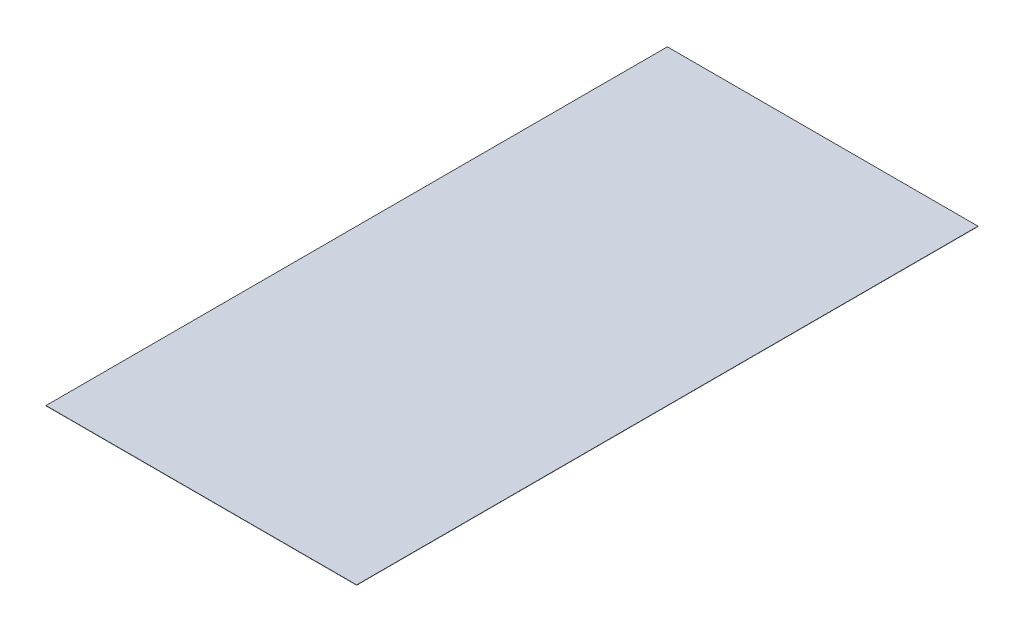
ISO-10303-21;
HEADER;
FILE_DESCRIPTION(('STEP AP214'),'2;1');
FILE_NAME('part.step','',(''),(''),'','','');
FILE_SCHEMA(('AUTOMOTIVE_DESIGN { 1 0 10303 214 1 1 1 1 }'));
ENDSEC;
DATA;
#1=APPLICATION_CONTEXT('core data for automotive mechanical design processes');
#2=APPLICATION_PROTOCOL_DEFINITION('international standard','automotive_design',2000,#1);
#3=PRODUCT_CONTEXT('',#1,'mechanical');
#4=PRODUCT('Part','Part','',(#3));
#5=PRODUCT_RELATED_PRODUCT_CATEGORY('part','',(#4));
#6=PRODUCT_DEFINITION_FORMATION('','',#4);
#7=PRODUCT_DEFINITION_CONTEXT('part definition',#1,'design');
#8=PRODUCT_DEFINITION('design','',#6,#7);
#9=PRODUCT_DEFINITION_SHAPE('','',#8);
#10=(LENGTH_UNIT() NAMED_UNIT(*) SI_UNIT(.MILLI.,.METRE.));
#11=(NAMED_UNIT(*) PLANE_ANGLE_UNIT() SI_UNIT($,.RADIAN.));
#12=(NAMED_UNIT(*) SI_UNIT($,.STERADIAN.) SOLID_ANGLE_UNIT());
#13=UNCERTAINTY_MEASURE_WITH_UNIT(LENGTH_MEASURE(1.E-05),#10,'distance_accuracy_value','');
#14=(GEOMETRIC_REPRESENTATION_CONTEXT(3) GLOBAL_UNCERTAINTY_ASSIGNED_CONTEXT((#13)) GLOBAL_UNIT_ASSIGNED_CONTEXT((#10,
#11,#12)) REPRESENTATION_CONTEXT('',''));
#15=CARTESIAN_POINT('',(0.,0.,0.));
#16=DIRECTION('',(0.,0.,1.));
#17=DIRECTION('',(1.,0.,0.));
#18=AXIS2_PLACEMENT_3D('',#15,#16,#17);
#19=CARTESIAN_POINT('',(625.,1.,1250.));
#20=DIRECTION('',(-1.,0.,0.));
#21=DIRECTION('',(0.,0.,1.));
#22=AXIS2_PLACEMENT_3D('',#19,#20,#21);
#23=PLANE('',#22);
#24=DIRECTION('',(0.,0.,-1.));
#25=VECTOR('',#24,1.);
#26=CARTESIAN_POINT('',(625.,0.,1250.));
#27=LINE('',#26,#25);
#28=CARTESIAN_POINT('',(625.,0.,1250.));
#29=VERTEX_POINT('',#28);
#30=CARTESIAN_POINT('',(625.,0.,-1250.));
#31=VERTEX_POINT('',#30);
#32=EDGE_CURVE('E104',#29,#31,#27,.T.);
#33=ORIENTED_EDGE('',*,*,#32,.T.);
#34=DIRECTION('',(0.,-1.,0.));
#35=VECTOR('',#34,1.);
#36=CARTESIAN_POINT('',(625.,1.,-1250.));
#37=LINE('',#36,#35);
#38=CARTESIAN_POINT('',(625.,1.,-1250.));
#39=VERTEX_POINT('',#38);
#40=EDGE_CURVE('E11',#39,#31,#37,.T.);
#41=ORIENTED_EDGE('',*,*,#40,.F.);
#42=DIRECTION('',(0.,0.,-1.));
#43=VECTOR('',#42,1.);
#44=CARTESIAN_POINT('',(625.,1.,1250.));
#45=LINE('',#44,#43);
#46=CARTESIAN_POINT('',(625.,1.,1250.));
#47=VERTEX_POINT('',#46);
#48=EDGE_CURVE('E92',#47,#39,#45,.T.);
#49=ORIENTED_EDGE('',*,*,#48,.F.);
#50=DIRECTION('',(0.,-1.,0.));
#51=VECTOR('',#50,1.);
#52=CARTESIAN_POINT('',(625.,1.,1250.));
#53=LINE('',#52,#51);
#54=EDGE_CURVE('E100',#47,#29,#53,.T.);
#55=ORIENTED_EDGE('',*,*,#54,.T.);
#56=EDGE_LOOP('',(#33,#41,#49,#55));
#57=FACE_BOUND('',#56,.T.);
#58=ADVANCED_FACE('F41',(#57),#23,.F.);
#59=CARTESIAN_POINT('',(-625.,1.,-1250.));
#60=DIRECTION('',(0.,0.,1.));
#61=DIRECTION('',(1.,0.,0.));
#62=AXIS2_PLACEMENT_3D('',#59,#60,#61);
#63=PLANE('',#62);
#64=DIRECTION('',(-1.,0.,0.));
#65=VECTOR('',#64,1.);
#66=CARTESIAN_POINT('',(-625.,0.,-1250.));
#67=LINE('',#66,#65);
#68=CARTESIAN_POINT('',(-625.,0.,-1250.));
#69=VERTEX_POINT('',#68);
#70=EDGE_CURVE('E96',#31,#69,#67,.T.);
#71=ORIENTED_EDGE('',*,*,#70,.T.);
#72=DIRECTION('',(0.,-1.,0.));
#73=VECTOR('',#72,1.);
#74=CARTESIAN_POINT('',(-625.,1.,-1250.));
#75=LINE('',#74,#73);
#76=CARTESIAN_POINT('',(-625.,1.,-1250.));
#77=VERTEX_POINT('',#76);
#78=EDGE_CURVE('E49',#77,#69,#75,.T.);
#79=ORIENTED_EDGE('',*,*,#78,.F.);
#80=DIRECTION('',(-1.,0.,0.));
#81=VECTOR('',#80,1.);
#82=CARTESIAN_POINT('',(-625.,1.,-1250.));
#83=LINE('',#82,#81);
#84=EDGE_CURVE('E87',#39,#77,#83,.T.);
#85=ORIENTED_EDGE('',*,*,#84,.F.);
#86=ORIENTED_EDGE('',*,*,#40,.T.);
#87=EDGE_LOOP('',(#71,#79,#85,#86));
#88=FACE_BOUND('',#87,.T.);
#89=ADVANCED_FACE('F95',(#88),#63,.F.);
#90=CARTESIAN_POINT('',(-625.,1.,1250.));
#91=DIRECTION('',(1.,0.,0.));
#92=DIRECTION('',(0.,0.,-1.));
#93=AXIS2_PLACEMENT_3D('',#90,#91,#92);
#94=PLANE('',#93);
#95=DIRECTION('',(0.,0.,1.));
#96=VECTOR('',#95,1.);
#97=CARTESIAN_POINT('',(-625.,0.,1250.));
#98=LINE('',#97,#96);
#99=CARTESIAN_POINT('',(-625.,0.,1250.));
#100=VERTEX_POINT('',#99);
#101=EDGE_CURVE('E74',#69,#100,#98,.T.);
#102=ORIENTED_EDGE('',*,*,#101,.T.);
#103=DIRECTION('',(0.,-1.,0.));
#104=VECTOR('',#103,1.);
#105=CARTESIAN_POINT('',(-625.,1.,1250.));
#106=LINE('',#105,#104);
#107=CARTESIAN_POINT('',(-625.,1.,1250.));
#108=VERTEX_POINT('',#107);
#109=EDGE_CURVE('E97',#108,#100,#106,.T.);
#110=ORIENTED_EDGE('',*,*,#109,.F.);
#111=DIRECTION('',(0.,0.,1.));
#112=VECTOR('',#111,1.);
#113=CARTESIAN_POINT('',(-625.,1.,1250.));
#114=LINE('',#113,#112);
#115=EDGE_CURVE('E90',#77,#108,#114,.T.);
#116=ORIENTED_EDGE('',*,*,#115,.F.);
#117=ORIENTED_EDGE('',*,*,#78,.T.);
#118=EDGE_LOOP('',(#102,#110,#116,#117));
#119=FACE_BOUND('',#118,.T.);
#120=ADVANCED_FACE('F98',(#119),#94,.F.);
#121=CARTESIAN_POINT('',(-625.,1.,1250.));
#122=DIRECTION('',(0.,0.,-1.));
#123=DIRECTION('',(-1.,0.,0.));
#124=AXIS2_PLACEMENT_3D('',#121,#122,#123);
#125=PLANE('',#124);
#126=DIRECTION('',(1.,0.,0.));
#127=VECTOR('',#126,1.);
#128=CARTESIAN_POINT('',(-625.,0.,1250.));
#129=LINE('',#128,#127);
#130=EDGE_CURVE('E80',#100,#29,#129,.T.);
#131=ORIENTED_EDGE('',*,*,#130,.T.);
#132=ORIENTED_EDGE('',*,*,#54,.F.);
#133=DIRECTION('',(1.,0.,0.));
#134=VECTOR('',#133,1.);
#135=CARTESIAN_POINT('',(-625.,1.,1250.));
#136=LINE('',#135,#134);
#137=EDGE_CURVE('E57',#108,#47,#136,.T.);
#138=ORIENTED_EDGE('',*,*,#137,.F.);
#139=ORIENTED_EDGE('',*,*,#109,.T.);
#140=EDGE_LOOP('',(#131,#132,#138,#139));
#141=FACE_BOUND('',#140,.T.);
#142=ADVANCED_FACE('F111',(#141),#125,.F.);
#143=CARTESIAN_POINT('',(0.,1.,0.));
#144=DIRECTION('',(0.,-1.,0.));
#145=DIRECTION('',(0.,0.,-1.));
#146=AXIS2_PLACEMENT_3D('',#143,#144,#145);
#147=PLANE('',#146);
#148=ORIENTED_EDGE('',*,*,#48,.T.);
#149=ORIENTED_EDGE('',*,*,#84,.T.);
#150=ORIENTED_EDGE('',*,*,#115,.T.);
#151=ORIENTED_EDGE('',*,*,#137,.T.);
#152=EDGE_LOOP('',(#148,#149,#150,#151));
#153=FACE_BOUND('',#152,.T.);
#154=ADVANCED_FACE('F88',(#153),#147,.F.);
#155=CARTESIAN_POINT('',(0.,0.,0.));
#156=DIRECTION('',(0.,-1.,0.));
#157=DIRECTION('',(0.,0.,-1.));
#158=AXIS2_PLACEMENT_3D('',#155,#156,#157);
#159=PLANE('',#158);
#160=ORIENTED_EDGE('',*,*,#32,.F.);
#161=ORIENTED_EDGE('',*,*,#130,.F.);
#162=ORIENTED_EDGE('',*,*,#101,.F.);
#163=ORIENTED_EDGE('',*,*,#70,.F.);
#164=EDGE_LOOP('',(#160,#161,#162,#163));
#165=FACE_BOUND('',#164,.T.);
#166=ADVANCED_FACE('F114',(#165),#159,.T.);
#167=CLOSED_SHELL('',(#58,#89,#120,#142,#154,#166));
#168=MANIFOLD_SOLID_BREP('B2',#167);
#169=ADVANCED_BREP_SHAPE_REPRESENTATION('',(#18,#168),#14);
#170=SHAPE_DEFINITION_REPRESENTATION(#9,#169);
ENDSEC;
END-ISO-10303-21;
